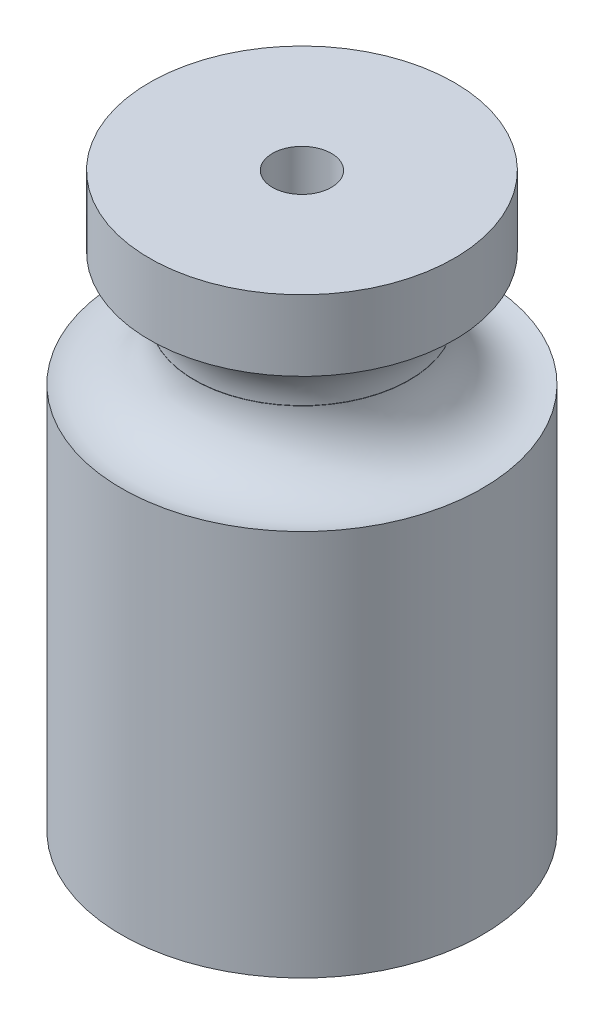
ISO-10303-21;
HEADER;
FILE_DESCRIPTION(('STEP AP214'),'2;1');
FILE_NAME('part.step','',(''),(''),'','','');
FILE_SCHEMA(('AUTOMOTIVE_DESIGN { 1 0 10303 214 1 1 1 1 }'));
ENDSEC;
DATA;
#1=APPLICATION_CONTEXT('core data for automotive mechanical design processes');
#2=APPLICATION_PROTOCOL_DEFINITION('international standard','automotive_design',2000,#1);
#3=PRODUCT_CONTEXT('',#1,'mechanical');
#4=PRODUCT('Part','Part','',(#3));
#5=PRODUCT_RELATED_PRODUCT_CATEGORY('part','',(#4));
#6=PRODUCT_DEFINITION_FORMATION('','',#4);
#7=PRODUCT_DEFINITION_CONTEXT('part definition',#1,'design');
#8=PRODUCT_DEFINITION('design','',#6,#7);
#9=PRODUCT_DEFINITION_SHAPE('','',#8);
#10=(LENGTH_UNIT() NAMED_UNIT(*) SI_UNIT(.MILLI.,.METRE.));
#11=(NAMED_UNIT(*) PLANE_ANGLE_UNIT() SI_UNIT($,.RADIAN.));
#12=(NAMED_UNIT(*) SI_UNIT($,.STERADIAN.) SOLID_ANGLE_UNIT());
#13=UNCERTAINTY_MEASURE_WITH_UNIT(LENGTH_MEASURE(1.E-05),#10,'distance_accuracy_value','');
#14=(GEOMETRIC_REPRESENTATION_CONTEXT(3) GLOBAL_UNCERTAINTY_ASSIGNED_CONTEXT((#13)) GLOBAL_UNIT_ASSIGNED_CONTEXT((#10,
#11,#12)) REPRESENTATION_CONTEXT('',''));
#15=CARTESIAN_POINT('',(0.,0.,0.));
#16=DIRECTION('',(0.,0.,1.));
#17=DIRECTION('',(1.,0.,0.));
#18=AXIS2_PLACEMENT_3D('',#15,#16,#17);
#19=CARTESIAN_POINT('',(0.,23.1296882352942,0.));
#20=DIRECTION('',(0.,-1.,0.));
#21=DIRECTION('',(0.,0.,-1.));
#22=AXIS2_PLACEMENT_3D('',#19,#20,#21);
#23=TOROIDAL_SURFACE('',#22,8.66775,3.07254053065212);
#24=CARTESIAN_POINT('',(0.,23.1388636125999,0.));
#25=DIRECTION('',(0.,-1.,0.));
#26=DIRECTION('',(0.,0.,-1.));
#27=AXIS2_PLACEMENT_3D('',#24,#25,#26);
#28=CIRCLE('',#27,5.59522316936836);
#29=CARTESIAN_POINT('',(0.,23.1388636125999,-5.59522316936836));
#30=VERTEX_POINT('',#29);
#31=EDGE_CURVE('E41',#30,#30,#28,.T.);
#32=ORIENTED_EDGE('',*,*,#31,.F.);
#33=EDGE_LOOP('',(#32));
#34=FACE_BOUND('',#33,.T.);
#35=CARTESIAN_POINT('',(0.,26.1141882352941,0.));
#36=DIRECTION('',(0.,-1.,0.));
#37=DIRECTION('',(0.,0.,-1.));
#38=AXIS2_PLACEMENT_3D('',#35,#36,#37);
#39=CIRCLE('',#38,7.9375);
#40=CARTESIAN_POINT('',(0.,26.1141882352941,-7.9375));
#41=VERTEX_POINT('',#40);
#42=EDGE_CURVE('E10',#41,#41,#39,.T.);
#43=ORIENTED_EDGE('',*,*,#42,.T.);
#44=EDGE_LOOP('',(#43));
#45=FACE_BOUND('',#44,.T.);
#46=ADVANCED_FACE('F15',(#34,#45),#23,.F.);
#47=CARTESIAN_POINT('',(0.,0.,0.));
#48=DIRECTION('',(0.,-1.,0.));
#49=DIRECTION('',(0.,0.,-1.));
#50=AXIS2_PLACEMENT_3D('',#47,#48,#49);
#51=CYLINDRICAL_SURFACE('',#50,7.9375);
#52=ORIENTED_EDGE('',*,*,#42,.F.);
#53=EDGE_LOOP('',(#52));
#54=FACE_BOUND('',#53,.T.);
#55=CARTESIAN_POINT('',(0.,29.7971882352942,0.));
#56=DIRECTION('',(0.,-1.,0.));
#57=DIRECTION('',(0.,0.,-1.));
#58=AXIS2_PLACEMENT_3D('',#55,#56,#57);
#59=CIRCLE('',#58,7.9375);
#60=CARTESIAN_POINT('',(0.,29.7971882352942,-7.9375));
#61=VERTEX_POINT('',#60);
#62=EDGE_CURVE('E22',#61,#61,#59,.T.);
#63=ORIENTED_EDGE('',*,*,#62,.T.);
#64=EDGE_LOOP('',(#63));
#65=FACE_BOUND('',#64,.T.);
#66=ADVANCED_FACE('F17',(#54,#65),#51,.T.);
#67=CARTESIAN_POINT('',(0.,29.7971882352942,0.));
#68=DIRECTION('',(0.,-1.,0.));
#69=DIRECTION('',(0.,0.,-1.));
#70=AXIS2_PLACEMENT_3D('',#67,#68,#69);
#71=PLANE('',#70);
#72=CARTESIAN_POINT('',(0.,29.7971882352942,0.));
#73=DIRECTION('',(0.,1.,0.));
#74=DIRECTION('',(0.,0.,1.));
#75=AXIS2_PLACEMENT_3D('',#72,#73,#74);
#76=CIRCLE('',#75,1.5367);
#77=CARTESIAN_POINT('',(0.,29.7971882352942,1.5367));
#78=VERTEX_POINT('',#77);
#79=EDGE_CURVE('E45',#78,#78,#76,.T.);
#80=ORIENTED_EDGE('',*,*,#79,.F.);
#81=EDGE_LOOP('',(#80));
#82=FACE_BOUND('',#81,.T.);
#83=ORIENTED_EDGE('',*,*,#62,.F.);
#84=EDGE_LOOP('',(#83));
#85=FACE_BOUND('',#84,.T.);
#86=ADVANCED_FACE('F60',(#82,#85),#71,.F.);
#87=CARTESIAN_POINT('',(0.,0.,0.));
#88=DIRECTION('',(0.,1.,0.));
#89=DIRECTION('',(0.,0.,1.));
#90=AXIS2_PLACEMENT_3D('',#87,#88,#89);
#91=PLANE('',#90);
#92=CARTESIAN_POINT('',(0.,0.,0.));
#93=DIRECTION('',(0.,-1.,0.));
#94=DIRECTION('',(0.,0.,-1.));
#95=AXIS2_PLACEMENT_3D('',#92,#93,#94);
#96=CIRCLE('',#95,9.398);
#97=CARTESIAN_POINT('',(0.,0.,-9.398));
#98=VERTEX_POINT('',#97);
#99=EDGE_CURVE('E26',#98,#98,#96,.T.);
#100=ORIENTED_EDGE('',*,*,#99,.T.);
#101=EDGE_LOOP('',(#100));
#102=FACE_BOUND('',#101,.T.);
#103=ADVANCED_FACE('F63',(#102),#91,.F.);
#104=CARTESIAN_POINT('',(0.,0.,0.));
#105=DIRECTION('',(0.,-1.,0.));
#106=DIRECTION('',(0.,0.,-1.));
#107=AXIS2_PLACEMENT_3D('',#104,#105,#106);
#108=CYLINDRICAL_SURFACE('',#107,9.398);
#109=ORIENTED_EDGE('',*,*,#99,.F.);
#110=EDGE_LOOP('',(#109));
#111=FACE_BOUND('',#110,.T.);
#112=CARTESIAN_POINT('',(0.,20.1451882352941,0.));
#113=DIRECTION('',(0.,-1.,0.));
#114=DIRECTION('',(0.,0.,-1.));
#115=AXIS2_PLACEMENT_3D('',#112,#113,#114);
#116=CIRCLE('',#115,9.398);
#117=CARTESIAN_POINT('',(0.,20.1451882352941,-9.398));
#118=VERTEX_POINT('',#117);
#119=EDGE_CURVE('E30',#118,#118,#116,.T.);
#120=ORIENTED_EDGE('',*,*,#119,.T.);
#121=EDGE_LOOP('',(#120));
#122=FACE_BOUND('',#121,.T.);
#123=ADVANCED_FACE('F70',(#111,#122),#108,.T.);
#124=ORIENTED_EDGE('',*,*,#119,.F.);
#125=EDGE_LOOP('',(#124));
#126=FACE_BOUND('',#125,.T.);
#127=CARTESIAN_POINT('',(0.,23.1240367462254,0.));
#128=DIRECTION('',(0.,-1.,0.));
#129=DIRECTION('',(0.,0.,-1.));
#130=AXIS2_PLACEMENT_3D('',#127,#128,#129);
#131=CIRCLE('',#130,5.5952146668962);
#132=CARTESIAN_POINT('',(0.,23.1240367462254,-5.5952146668962));
#133=VERTEX_POINT('',#132);
#134=EDGE_CURVE('E35',#133,#133,#131,.T.);
#135=ORIENTED_EDGE('',*,*,#134,.T.);
#136=EDGE_LOOP('',(#135));
#137=FACE_BOUND('',#136,.T.);
#138=ADVANCED_FACE('F77',(#126,#137),#23,.F.);
#139=CARTESIAN_POINT('',(0.,23.1296882352942,0.));
#140=DIRECTION('',(0.,-1.,0.));
#141=DIRECTION('',(0.,0.,-1.));
#142=AXIS2_PLACEMENT_3D('',#139,#140,#141);
#143=CONICAL_SURFACE('',#142,5.588,0.906300927700373);
#144=ORIENTED_EDGE('',*,*,#134,.F.);
#145=EDGE_LOOP('',(#144));
#146=FACE_BOUND('',#145,.T.);
#147=CARTESIAN_POINT('',(0.,23.1296882352942,0.));
#148=DIRECTION('',(0.,-1.,0.));
#149=DIRECTION('',(0.,0.,-1.));
#150=AXIS2_PLACEMENT_3D('',#147,#148,#149);
#151=CIRCLE('',#150,5.588);
#152=CARTESIAN_POINT('',(0.,23.1296882352942,-5.588));
#153=VERTEX_POINT('',#152);
#154=EDGE_CURVE('E38',#153,#153,#151,.T.);
#155=ORIENTED_EDGE('',*,*,#154,.T.);
#156=EDGE_LOOP('',(#155));
#157=FACE_BOUND('',#156,.T.);
#158=ADVANCED_FACE('F85',(#146,#157),#143,.T.);
#159=CARTESIAN_POINT('',(0.,23.1388636125999,0.));
#160=DIRECTION('',(0.,1.,0.));
#161=DIRECTION('',(0.,0.,1.));
#162=AXIS2_PLACEMENT_3D('',#159,#160,#161);
#163=CONICAL_SURFACE('',#162,5.59522316936836,0.66690820423934);
#164=ORIENTED_EDGE('',*,*,#154,.F.);
#165=EDGE_LOOP('',(#164));
#166=FACE_BOUND('',#165,.T.);
#167=ORIENTED_EDGE('',*,*,#31,.T.);
#168=EDGE_LOOP('',(#167));
#169=FACE_BOUND('',#168,.T.);
#170=ADVANCED_FACE('F56',(#166,#169),#163,.T.);
#171=CARTESIAN_POINT('',(0.,21.0087882352941,0.));
#172=DIRECTION('',(0.,1.,0.));
#173=DIRECTION('',(0.,0.,1.));
#174=AXIS2_PLACEMENT_3D('',#171,#172,#173);
#175=CYLINDRICAL_SURFACE('',#174,1.5367);
#176=CARTESIAN_POINT('',(0.,21.0087882352941,0.));
#177=DIRECTION('',(0.,1.,0.));
#178=DIRECTION('',(0.,0.,1.));
#179=AXIS2_PLACEMENT_3D('',#176,#177,#178);
#180=CIRCLE('',#179,1.5367);
#181=CARTESIAN_POINT('',(0.,21.0087882352941,1.5367));
#182=VERTEX_POINT('',#181);
#183=EDGE_CURVE('E44',#182,#182,#180,.T.);
#184=ORIENTED_EDGE('',*,*,#183,.F.);
#185=EDGE_LOOP('',(#184));
#186=FACE_BOUND('',#185,.T.);
#187=ORIENTED_EDGE('',*,*,#79,.T.);
#188=EDGE_LOOP('',(#187));
#189=FACE_BOUND('',#188,.T.);
#190=ADVANCED_FACE('F53',(#186,#189),#175,.F.);
#191=CARTESIAN_POINT('',(0.,21.0087882352941,0.));
#192=DIRECTION('',(0.,1.,0.));
#193=DIRECTION('',(0.,0.,1.));
#194=AXIS2_PLACEMENT_3D('',#191,#192,#193);
#195=PLANE('',#194);
#196=ORIENTED_EDGE('',*,*,#183,.T.);
#197=EDGE_LOOP('',(#196));
#198=FACE_BOUND('',#197,.T.);
#199=ADVANCED_FACE('F51',(#198),#195,.T.);
#200=CLOSED_SHELL('',(#46,#66,#86,#103,#123,#138,#158,#170,#190,#199));
#201=MANIFOLD_SOLID_BREP('B1',#200);
#202=ADVANCED_BREP_SHAPE_REPRESENTATION('',(#18,#201),#14);
#203=SHAPE_DEFINITION_REPRESENTATION(#9,#202);
ENDSEC;
END-ISO-10303-21;
